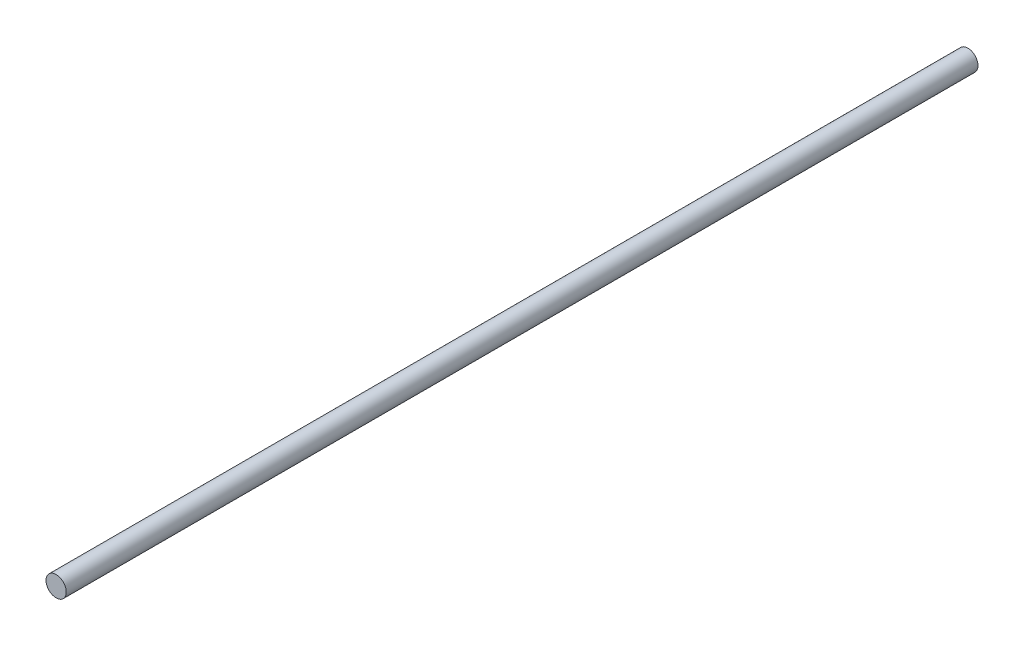
ISO-10303-21;
HEADER;
FILE_DESCRIPTION(('STEP AP214'),'2;1');
FILE_NAME('part.step','',(''),(''),'','','');
FILE_SCHEMA(('AUTOMOTIVE_DESIGN { 1 0 10303 214 1 1 1 1 }'));
ENDSEC;
DATA;
#1=APPLICATION_CONTEXT('core data for automotive mechanical design processes');
#2=APPLICATION_PROTOCOL_DEFINITION('international standard','automotive_design',2000,#1);
#3=PRODUCT_CONTEXT('',#1,'mechanical');
#4=PRODUCT('Part','Part','',(#3));
#5=PRODUCT_RELATED_PRODUCT_CATEGORY('part','',(#4));
#6=PRODUCT_DEFINITION_FORMATION('','',#4);
#7=PRODUCT_DEFINITION_CONTEXT('part definition',#1,'design');
#8=PRODUCT_DEFINITION('design','',#6,#7);
#9=PRODUCT_DEFINITION_SHAPE('','',#8);
#10=(LENGTH_UNIT() NAMED_UNIT(*) SI_UNIT(.MILLI.,.METRE.));
#11=(NAMED_UNIT(*) PLANE_ANGLE_UNIT() SI_UNIT($,.RADIAN.));
#12=(NAMED_UNIT(*) SI_UNIT($,.STERADIAN.) SOLID_ANGLE_UNIT());
#13=UNCERTAINTY_MEASURE_WITH_UNIT(LENGTH_MEASURE(1.E-05),#10,'distance_accuracy_value','');
#14=(GEOMETRIC_REPRESENTATION_CONTEXT(3) GLOBAL_UNCERTAINTY_ASSIGNED_CONTEXT((#13)) GLOBAL_UNIT_ASSIGNED_CONTEXT((#10,
#11,#12)) REPRESENTATION_CONTEXT('',''));
#15=CARTESIAN_POINT('',(0.,0.,0.));
#16=DIRECTION('',(0.,0.,1.));
#17=DIRECTION('',(1.,0.,0.));
#18=AXIS2_PLACEMENT_3D('',#15,#16,#17);
#19=CARTESIAN_POINT('',(0.,0.,360.));
#20=DIRECTION('',(0.,0.,-1.));
#21=DIRECTION('',(-1.,0.,0.));
#22=AXIS2_PLACEMENT_3D('',#19,#20,#21);
#23=CYLINDRICAL_SURFACE('',#22,4.);
#24=CARTESIAN_POINT('',(0.,0.,360.));
#25=DIRECTION('',(0.,0.,1.));
#26=DIRECTION('',(1.,0.,0.));
#27=AXIS2_PLACEMENT_3D('',#24,#25,#26);
#28=CIRCLE('',#27,4.);
#29=CARTESIAN_POINT('',(-4.,0.,360.));
#30=VERTEX_POINT('',#29);
#31=EDGE_CURVE('E10',#30,#30,#28,.T.);
#32=CARTESIAN_POINT('',(0.,0.,0.));
#33=DIRECTION('',(0.,0.,1.));
#34=DIRECTION('',(1.,0.,0.));
#35=AXIS2_PLACEMENT_3D('',#32,#33,#34);
#36=CIRCLE('',#35,4.);
#37=CARTESIAN_POINT('',(-4.,0.,0.));
#38=VERTEX_POINT('',#37);
#39=EDGE_CURVE('E34',#38,#38,#36,.T.);
#40=CARTESIAN_POINT('',(-4.,0.,360.));
#41=CARTESIAN_POINT('',(-4.,0.,356.25));
#42=CARTESIAN_POINT('',(-4.,0.,352.5));
#43=CARTESIAN_POINT('',(-4.,0.,345.));
#44=CARTESIAN_POINT('',(-4.,0.,341.25));
#45=CARTESIAN_POINT('',(-4.,0.,333.75));
#46=CARTESIAN_POINT('',(-4.,0.,330.));
#47=CARTESIAN_POINT('',(-4.,0.,322.5));
#48=CARTESIAN_POINT('',(-4.,0.,318.75));
#49=CARTESIAN_POINT('',(-4.,0.,311.25));
#50=CARTESIAN_POINT('',(-4.,0.,307.5));
#51=CARTESIAN_POINT('',(-4.,0.,300.));
#52=CARTESIAN_POINT('',(-4.,0.,296.25));
#53=CARTESIAN_POINT('',(-4.,0.,288.75));
#54=CARTESIAN_POINT('',(-4.,0.,285.));
#55=CARTESIAN_POINT('',(-4.,0.,277.5));
#56=CARTESIAN_POINT('',(-4.,0.,273.75));
#57=CARTESIAN_POINT('',(-4.,0.,266.25));
#58=CARTESIAN_POINT('',(-4.,0.,262.5));
#59=CARTESIAN_POINT('',(-4.,0.,255.));
#60=CARTESIAN_POINT('',(-4.,0.,251.25));
#61=CARTESIAN_POINT('',(-4.,0.,243.75));
#62=CARTESIAN_POINT('',(-4.,0.,240.));
#63=CARTESIAN_POINT('',(-4.,0.,232.5));
#64=CARTESIAN_POINT('',(-4.,0.,228.75));
#65=CARTESIAN_POINT('',(-4.,0.,221.25));
#66=CARTESIAN_POINT('',(-4.,0.,217.5));
#67=CARTESIAN_POINT('',(-4.,0.,210.));
#68=CARTESIAN_POINT('',(-4.,0.,206.25));
#69=CARTESIAN_POINT('',(-4.,0.,198.75));
#70=CARTESIAN_POINT('',(-4.,0.,195.));
#71=CARTESIAN_POINT('',(-4.,0.,187.5));
#72=CARTESIAN_POINT('',(-4.,0.,183.75));
#73=CARTESIAN_POINT('',(-4.,0.,176.25));
#74=CARTESIAN_POINT('',(-4.,0.,172.5));
#75=CARTESIAN_POINT('',(-4.,0.,165.));
#76=CARTESIAN_POINT('',(-4.,0.,161.25));
#77=CARTESIAN_POINT('',(-4.,0.,153.75));
#78=CARTESIAN_POINT('',(-4.,0.,150.));
#79=CARTESIAN_POINT('',(-4.,0.,142.5));
#80=CARTESIAN_POINT('',(-4.,0.,138.75));
#81=CARTESIAN_POINT('',(-4.,0.,131.25));
#82=CARTESIAN_POINT('',(-4.,0.,127.5));
#83=CARTESIAN_POINT('',(-4.,0.,120.));
#84=CARTESIAN_POINT('',(-4.,0.,116.25));
#85=CARTESIAN_POINT('',(-4.,0.,108.75));
#86=CARTESIAN_POINT('',(-4.,0.,105.));
#87=CARTESIAN_POINT('',(-4.,0.,97.5));
#88=CARTESIAN_POINT('',(-4.,0.,93.75));
#89=CARTESIAN_POINT('',(-4.,0.,86.25));
#90=CARTESIAN_POINT('',(-4.,0.,82.5));
#91=CARTESIAN_POINT('',(-4.,0.,75.));
#92=CARTESIAN_POINT('',(-4.,0.,71.25));
#93=CARTESIAN_POINT('',(-4.,0.,63.75));
#94=CARTESIAN_POINT('',(-4.,0.,60.));
#95=CARTESIAN_POINT('',(-4.,0.,52.5));
#96=CARTESIAN_POINT('',(-4.,0.,48.75));
#97=CARTESIAN_POINT('',(-4.,0.,41.25));
#98=CARTESIAN_POINT('',(-4.,0.,37.5));
#99=CARTESIAN_POINT('',(-4.,0.,30.));
#100=CARTESIAN_POINT('',(-4.,0.,26.25));
#101=CARTESIAN_POINT('',(-4.,0.,18.75));
#102=CARTESIAN_POINT('',(-4.,0.,14.9999999999999));
#103=CARTESIAN_POINT('',(-4.,0.,7.49999999999993));
#104=CARTESIAN_POINT('',(-4.,0.,3.74999999999994));
#105=CARTESIAN_POINT('',(-4.,0.,0.));
#106=B_SPLINE_CURVE_WITH_KNOTS('',3,(#40,#41,#42,#43,#44,#45,#46,#47,#48,#49,#50,#51,#52,#53,
#54,#55,#56,#57,#58,#59,#60,#61,#62,#63,#64,#65,#66,#67,#68,#69,#70,#71,#72,#73,#74,#75,#76,#77,
#78,#79,#80,#81,#82,#83,#84,#85,#86,#87,#88,#89,#90,#91,#92,#93,#94,#95,#96,#97,#98,#99,#100,
#101,#102,#103,#104,#105),.UNSPECIFIED.,.F.,.F.,(4,2,2,2,2,2,2,2,2,2,2,2,2,2,2,2,2,2,2,2,2,2,2,
2,2,2,2,2,2,2,2,2,4),(0.,11.25,22.5,33.7500000000001,45.,56.25,67.5,78.75,90.,101.25,112.5,
123.75,135.,146.25,157.5,168.75,180.,191.25,202.5,213.75,225.,236.25,247.5,258.75,270.,281.25,
292.5,303.75,315.,326.25,337.5,348.75,360.),.UNSPECIFIED.);
#107=EDGE_CURVE('BSEAM31',#30,#38,#106,.T.);
#108=ORIENTED_EDGE('',*,*,#31,.F.);
#109=ORIENTED_EDGE('',*,*,#39,.T.);
#110=ORIENTED_EDGE('',*,*,#107,.T.);
#111=ORIENTED_EDGE('',*,*,#107,.F.);
#112=EDGE_LOOP('',(#108,#110,#109,#111));
#113=FACE_BOUND('',#112,.T.);
#114=ADVANCED_FACE('F31',(#113),#23,.T.);
#115=CARTESIAN_POINT('',(0.,0.,360.));
#116=DIRECTION('',(0.,0.,1.));
#117=DIRECTION('',(1.,0.,0.));
#118=AXIS2_PLACEMENT_3D('',#115,#116,#117);
#119=PLANE('',#118);
#120=ORIENTED_EDGE('',*,*,#31,.T.);
#121=EDGE_LOOP('',(#120));
#122=FACE_BOUND('',#121,.T.);
#123=ADVANCED_FACE('F46',(#122),#119,.T.);
#124=CARTESIAN_POINT('',(0.,0.,0.));
#125=DIRECTION('',(0.,0.,1.));
#126=DIRECTION('',(1.,0.,0.));
#127=AXIS2_PLACEMENT_3D('',#124,#125,#126);
#128=PLANE('',#127);
#129=ORIENTED_EDGE('',*,*,#39,.F.);
#130=EDGE_LOOP('',(#129));
#131=FACE_BOUND('',#130,.T.);
#132=ADVANCED_FACE('F44',(#131),#128,.F.);
#133=CLOSED_SHELL('',(#114,#123,#132));
#134=MANIFOLD_SOLID_BREP('B2',#133);
#135=ADVANCED_BREP_SHAPE_REPRESENTATION('',(#18,#134),#14);
#136=SHAPE_DEFINITION_REPRESENTATION(#9,#135);
ENDSEC;
END-ISO-10303-21;
